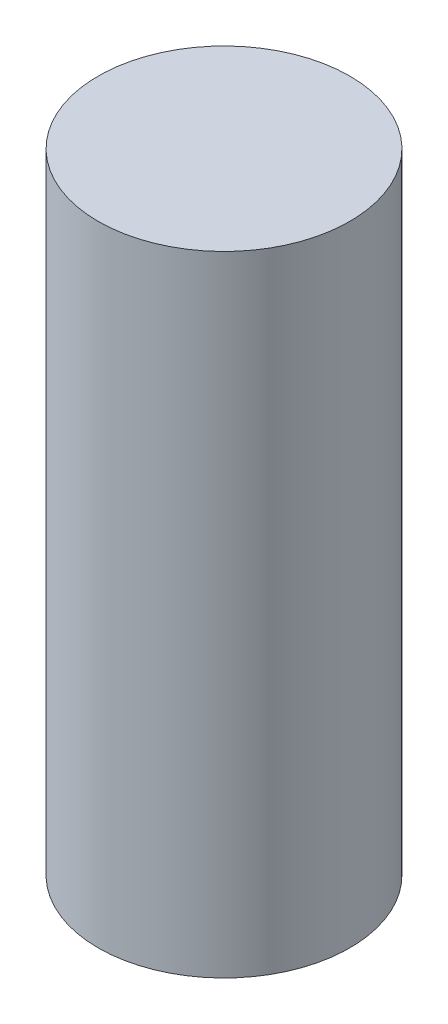
ISO-10303-21;
HEADER;
FILE_DESCRIPTION(('STEP AP214'),'2;1');
FILE_NAME('part.step','',(''),(''),'','','');
FILE_SCHEMA(('AUTOMOTIVE_DESIGN { 1 0 10303 214 1 1 1 1 }'));
ENDSEC;
DATA;
#1=APPLICATION_CONTEXT('core data for automotive mechanical design processes');
#2=APPLICATION_PROTOCOL_DEFINITION('international standard','automotive_design',2000,#1);
#3=PRODUCT_CONTEXT('',#1,'mechanical');
#4=PRODUCT('Part','Part','',(#3));
#5=PRODUCT_RELATED_PRODUCT_CATEGORY('part','',(#4));
#6=PRODUCT_DEFINITION_FORMATION('','',#4);
#7=PRODUCT_DEFINITION_CONTEXT('part definition',#1,'design');
#8=PRODUCT_DEFINITION('design','',#6,#7);
#9=PRODUCT_DEFINITION_SHAPE('','',#8);
#10=(LENGTH_UNIT() NAMED_UNIT(*) SI_UNIT(.MILLI.,.METRE.));
#11=(NAMED_UNIT(*) PLANE_ANGLE_UNIT() SI_UNIT($,.RADIAN.));
#12=(NAMED_UNIT(*) SI_UNIT($,.STERADIAN.) SOLID_ANGLE_UNIT());
#13=UNCERTAINTY_MEASURE_WITH_UNIT(LENGTH_MEASURE(1.E-05),#10,'distance_accuracy_value','');
#14=(GEOMETRIC_REPRESENTATION_CONTEXT(3) GLOBAL_UNCERTAINTY_ASSIGNED_CONTEXT((#13)) GLOBAL_UNIT_ASSIGNED_CONTEXT((#10,
#11,#12)) REPRESENTATION_CONTEXT('',''));
#15=CARTESIAN_POINT('',(0.,0.,0.));
#16=DIRECTION('',(0.,0.,1.));
#17=DIRECTION('',(1.,0.,0.));
#18=AXIS2_PLACEMENT_3D('',#15,#16,#17);
#19=CARTESIAN_POINT('',(0.,200.,0.));
#20=DIRECTION('',(0.,-1.,0.));
#21=DIRECTION('',(0.,0.,-1.));
#22=AXIS2_PLACEMENT_3D('',#19,#20,#21);
#23=CYLINDRICAL_SURFACE('',#22,40.);
#24=CARTESIAN_POINT('',(0.,200.,0.));
#25=DIRECTION('',(0.,1.,0.));
#26=DIRECTION('',(0.,0.,1.));
#27=AXIS2_PLACEMENT_3D('',#24,#25,#26);
#28=CIRCLE('',#27,40.);
#29=CARTESIAN_POINT('',(0.,200.,40.));
#30=VERTEX_POINT('',#29);
#31=EDGE_CURVE('E10',#30,#30,#28,.T.);
#32=ORIENTED_EDGE('',*,*,#31,.F.);
#33=EDGE_LOOP('',(#32));
#34=FACE_BOUND('',#33,.T.);
#35=CARTESIAN_POINT('',(0.,0.,0.));
#36=DIRECTION('',(0.,1.,0.));
#37=DIRECTION('',(0.,0.,1.));
#38=AXIS2_PLACEMENT_3D('',#35,#36,#37);
#39=CIRCLE('',#38,40.);
#40=CARTESIAN_POINT('',(0.,0.,40.));
#41=VERTEX_POINT('',#40);
#42=EDGE_CURVE('E33',#41,#41,#39,.T.);
#43=ORIENTED_EDGE('',*,*,#42,.T.);
#44=EDGE_LOOP('',(#43));
#45=FACE_BOUND('',#44,.T.);
#46=ADVANCED_FACE('F30',(#34,#45),#23,.T.);
#47=CARTESIAN_POINT('',(0.,200.,0.));
#48=DIRECTION('',(0.,1.,0.));
#49=DIRECTION('',(0.,0.,1.));
#50=AXIS2_PLACEMENT_3D('',#47,#48,#49);
#51=PLANE('',#50);
#52=ORIENTED_EDGE('',*,*,#31,.T.);
#53=EDGE_LOOP('',(#52));
#54=FACE_BOUND('',#53,.T.);
#55=ADVANCED_FACE('F45',(#54),#51,.T.);
#56=CARTESIAN_POINT('',(0.,0.,0.));
#57=DIRECTION('',(0.,1.,0.));
#58=DIRECTION('',(0.,0.,1.));
#59=AXIS2_PLACEMENT_3D('',#56,#57,#58);
#60=PLANE('',#59);
#61=ORIENTED_EDGE('',*,*,#42,.F.);
#62=EDGE_LOOP('',(#61));
#63=FACE_BOUND('',#62,.T.);
#64=ADVANCED_FACE('F43',(#63),#60,.F.);
#65=CLOSED_SHELL('',(#46,#55,#64));
#66=MANIFOLD_SOLID_BREP('B2',#65);
#67=ADVANCED_BREP_SHAPE_REPRESENTATION('',(#18,#66),#14);
#68=SHAPE_DEFINITION_REPRESENTATION(#9,#67);
ENDSEC;
END-ISO-10303-21;
